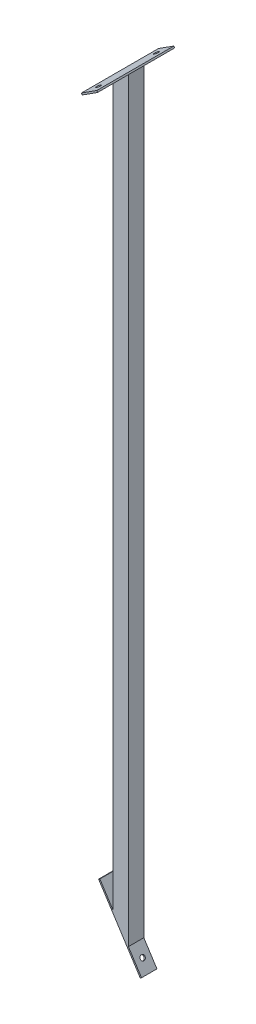
ISO-10303-21;
HEADER;
FILE_DESCRIPTION(('STEP AP214'),'2;1');
FILE_NAME('part.step','',(''),(''),'','','');
FILE_SCHEMA(('AUTOMOTIVE_DESIGN { 1 0 10303 214 1 1 1 1 }'));
ENDSEC;
DATA;
#1=APPLICATION_CONTEXT('core data for automotive mechanical design processes');
#2=APPLICATION_PROTOCOL_DEFINITION('international standard','automotive_design',2000,#1);
#3=PRODUCT_CONTEXT('',#1,'mechanical');
#4=PRODUCT('Part','Part','',(#3));
#5=PRODUCT_RELATED_PRODUCT_CATEGORY('part','',(#4));
#6=PRODUCT_DEFINITION_FORMATION('','',#4);
#7=PRODUCT_DEFINITION_CONTEXT('part definition',#1,'design');
#8=PRODUCT_DEFINITION('design','',#6,#7);
#9=PRODUCT_DEFINITION_SHAPE('','',#8);
#10=(LENGTH_UNIT() NAMED_UNIT(*) SI_UNIT(.MILLI.,.METRE.));
#11=(NAMED_UNIT(*) PLANE_ANGLE_UNIT() SI_UNIT($,.RADIAN.));
#12=(NAMED_UNIT(*) SI_UNIT($,.STERADIAN.) SOLID_ANGLE_UNIT());
#13=UNCERTAINTY_MEASURE_WITH_UNIT(LENGTH_MEASURE(1.E-05),#10,'distance_accuracy_value','');
#14=(GEOMETRIC_REPRESENTATION_CONTEXT(3) GLOBAL_UNCERTAINTY_ASSIGNED_CONTEXT((#13)) GLOBAL_UNIT_ASSIGNED_CONTEXT((#10,
#11,#12)) REPRESENTATION_CONTEXT('',''));
#15=CARTESIAN_POINT('',(0.,0.,0.));
#16=DIRECTION('',(0.,0.,1.));
#17=DIRECTION('',(1.,0.,0.));
#18=AXIS2_PLACEMENT_3D('',#15,#16,#17);
#19=CARTESIAN_POINT('',(-446.916807878554,695.141308373975,0.));
#20=DIRECTION('',(0.540792055418549,-0.841156318882632,0.));
#21=DIRECTION('',(0.841156318882632,0.540792055418549,0.));
#22=AXIS2_PLACEMENT_3D('',#19,#20,#21);
#23=PLANE('',#22);
#24=CARTESIAN_POINT('',(0.,982.470849516569,37.5));
#25=DIRECTION('',(-0.540792055418549,0.841156318882632,0.));
#26=DIRECTION('',(-0.841156318882632,-0.540792055418549,0.));
#27=AXIS2_PLACEMENT_3D('',#24,#25,#26);
#28=CIRCLE('',#27,3.12500000000005);
#29=CARTESIAN_POINT('',(-2.62861349650831,980.780874343386,37.5));
#30=VERTEX_POINT('',#29);
#31=EDGE_CURVE('E573',#30,#30,#28,.T.);
#32=ORIENTED_EDGE('',*,*,#31,.T.);
#33=EDGE_LOOP('',(#32));
#34=FACE_BOUND('',#33,.T.);
#35=DIRECTION('',(0.841156318882634,0.540792055418547,0.));
#36=VECTOR('',#35,1.);
#37=CARTESIAN_POINT('',(10.,988.9,10.));
#38=LINE('',#37,#36);
#39=CARTESIAN_POINT('',(-9.9999999999999,976.041699033138,10.));
#40=VERTEX_POINT('',#39);
#41=CARTESIAN_POINT('',(10.,988.9,10.));
#42=VERTEX_POINT('',#41);
#43=EDGE_CURVE('E248',#40,#42,#38,.T.);
#44=ORIENTED_EDGE('',*,*,#43,.T.);
#45=DIRECTION('',(0.,0.,-1.));
#46=VECTOR('',#45,1.);
#47=CARTESIAN_POINT('',(10.,988.9,50.));
#48=LINE('',#47,#46);
#49=CARTESIAN_POINT('',(10.,988.9,50.));
#50=VERTEX_POINT('',#49);
#51=EDGE_CURVE('E564',#50,#42,#48,.T.);
#52=ORIENTED_EDGE('',*,*,#51,.F.);
#53=DIRECTION('',(0.841156318882632,0.540792055418549,0.));
#54=VECTOR('',#53,1.);
#55=CARTESIAN_POINT('',(-9.9999999999999,976.041699033138,50.));
#56=LINE('',#55,#54);
#57=CARTESIAN_POINT('',(-9.9999999999999,976.041699033138,50.));
#58=VERTEX_POINT('',#57);
#59=EDGE_CURVE('E189',#58,#50,#56,.T.);
#60=ORIENTED_EDGE('',*,*,#59,.F.);
#61=DIRECTION('',(0.,0.,1.));
#62=VECTOR('',#61,1.);
#63=CARTESIAN_POINT('',(-9.9999999999999,976.041699033138,50.));
#64=LINE('',#63,#62);
#65=EDGE_CURVE('E550',#40,#58,#64,.T.);
#66=ORIENTED_EDGE('',*,*,#65,.F.);
#67=EDGE_LOOP('',(#44,#52,#60,#66));
#68=FACE_BOUND('',#67,.T.);
#69=ADVANCED_FACE('F52',(#34,#68),#23,.T.);
#70=CARTESIAN_POINT('',(0.,982.470849516569,-37.5));
#71=DIRECTION('',(-0.540792055418549,0.841156318882632,0.));
#72=DIRECTION('',(-0.841156318882632,-0.540792055418549,0.));
#73=AXIS2_PLACEMENT_3D('',#70,#71,#72);
#74=CIRCLE('',#73,3.12500000000005);
#75=CARTESIAN_POINT('',(-2.62861349650831,980.780874343386,-37.5));
#76=VERTEX_POINT('',#75);
#77=EDGE_CURVE('E566',#76,#76,#74,.T.);
#78=ORIENTED_EDGE('',*,*,#77,.T.);
#79=EDGE_LOOP('',(#78));
#80=FACE_BOUND('',#79,.T.);
#81=DIRECTION('',(0.841156318882634,0.540792055418547,0.));
#82=VECTOR('',#81,1.);
#83=CARTESIAN_POINT('',(10.,988.9,-10.));
#84=LINE('',#83,#82);
#85=CARTESIAN_POINT('',(-10.,976.041699033138,-10.));
#86=VERTEX_POINT('',#85);
#87=CARTESIAN_POINT('',(10.,988.9,-10.));
#88=VERTEX_POINT('',#87);
#89=EDGE_CURVE('E249',#86,#88,#84,.T.);
#90=ORIENTED_EDGE('',*,*,#89,.F.);
#91=CARTESIAN_POINT('',(-9.9999999999999,976.041699033138,-50.));
#92=VERTEX_POINT('',#91);
#93=EDGE_CURVE('E549',#92,#86,#64,.T.);
#94=ORIENTED_EDGE('',*,*,#93,.F.);
#95=DIRECTION('',(-0.841156318882632,-0.540792055418549,0.));
#96=VECTOR('',#95,1.);
#97=CARTESIAN_POINT('',(-9.9999999999999,976.041699033138,-50.));
#98=LINE('',#97,#96);
#99=CARTESIAN_POINT('',(10.,988.9,-50.));
#100=VERTEX_POINT('',#99);
#101=EDGE_CURVE('E553',#100,#92,#98,.T.);
#102=ORIENTED_EDGE('',*,*,#101,.F.);
#103=EDGE_CURVE('E195',#88,#100,#48,.T.);
#104=ORIENTED_EDGE('',*,*,#103,.F.);
#105=EDGE_LOOP('',(#90,#94,#102,#104));
#106=FACE_BOUND('',#105,.T.);
#107=ADVANCED_FACE('F338',(#80,#106),#23,.T.);
#108=CARTESIAN_POINT('',(8.91841588916291,990.582312637765,50.));
#109=DIRECTION('',(-0.841156318882634,-0.540792055418547,0.));
#110=DIRECTION('',(0.540792055418547,-0.841156318882634,0.));
#111=AXIS2_PLACEMENT_3D('',#108,#109,#110);
#112=PLANE('',#111);
#113=ORIENTED_EDGE('',*,*,#51,.T.);
#114=DIRECTION('',(0.,0.,-1.));
#115=VECTOR('',#114,1.);
#116=CARTESIAN_POINT('',(10.,988.9,-10.));
#117=LINE('',#116,#115);
#118=EDGE_CURVE('E268',#42,#88,#117,.T.);
#119=ORIENTED_EDGE('',*,*,#118,.T.);
#120=ORIENTED_EDGE('',*,*,#103,.T.);
#121=DIRECTION('',(0.540792055418547,-0.841156318882634,0.));
#122=VECTOR('',#121,1.);
#123=CARTESIAN_POINT('',(8.91841588916291,990.582312637765,-50.));
#124=LINE('',#123,#122);
#125=CARTESIAN_POINT('',(8.91841588916291,990.582312637765,-50.));
#126=VERTEX_POINT('',#125);
#127=EDGE_CURVE('E174',#126,#100,#124,.T.);
#128=ORIENTED_EDGE('',*,*,#127,.F.);
#129=DIRECTION('',(0.,0.,-1.));
#130=VECTOR('',#129,1.);
#131=CARTESIAN_POINT('',(8.91841588916291,990.582312637765,50.));
#132=LINE('',#131,#130);
#133=CARTESIAN_POINT('',(8.91841588916291,990.582312637765,50.));
#134=VERTEX_POINT('',#133);
#135=EDGE_CURVE('E180',#134,#126,#132,.T.);
#136=ORIENTED_EDGE('',*,*,#135,.F.);
#137=DIRECTION('',(0.540792055418547,-0.841156318882634,0.));
#138=VECTOR('',#137,1.);
#139=CARTESIAN_POINT('',(8.91841588916291,990.582312637765,50.));
#140=LINE('',#139,#138);
#141=EDGE_CURVE('E557',#134,#50,#140,.T.);
#142=ORIENTED_EDGE('',*,*,#141,.T.);
#143=EDGE_LOOP('',(#113,#119,#120,#128,#136,#142));
#144=FACE_BOUND('',#143,.T.);
#145=ADVANCED_FACE('F192',(#144),#112,.F.);
#146=CARTESIAN_POINT('',(-11.081584110837,977.724011670903,-50.));
#147=DIRECTION('',(0.,0.,1.));
#148=DIRECTION('',(1.,0.,0.));
#149=AXIS2_PLACEMENT_3D('',#146,#147,#148);
#150=PLANE('',#149);
#151=ORIENTED_EDGE('',*,*,#101,.T.);
#152=DIRECTION('',(0.540792055418547,-0.841156318882634,0.));
#153=VECTOR('',#152,1.);
#154=CARTESIAN_POINT('',(-11.081584110837,977.724011670903,-50.));
#155=LINE('',#154,#153);
#156=CARTESIAN_POINT('',(-11.081584110837,977.724011670903,-50.));
#157=VERTEX_POINT('',#156);
#158=EDGE_CURVE('E176',#157,#92,#155,.T.);
#159=ORIENTED_EDGE('',*,*,#158,.F.);
#160=DIRECTION('',(-0.841156318882632,-0.540792055418549,0.));
#161=VECTOR('',#160,1.);
#162=CARTESIAN_POINT('',(-11.081584110837,977.724011670903,-50.));
#163=LINE('',#162,#161);
#164=EDGE_CURVE('E170',#126,#157,#163,.T.);
#165=ORIENTED_EDGE('',*,*,#164,.F.);
#166=ORIENTED_EDGE('',*,*,#127,.T.);
#167=EDGE_LOOP('',(#151,#159,#165,#166));
#168=FACE_BOUND('',#167,.T.);
#169=ADVANCED_FACE('F172',(#168),#150,.F.);
#170=CARTESIAN_POINT('',(-11.081584110837,977.724011670903,50.));
#171=DIRECTION('',(0.841156318882634,0.540792055418547,0.));
#172=DIRECTION('',(-0.540792055418547,0.841156318882634,0.));
#173=AXIS2_PLACEMENT_3D('',#170,#171,#172);
#174=PLANE('',#173);
#175=ORIENTED_EDGE('',*,*,#93,.T.);
#176=DIRECTION('',(0.,0.,1.));
#177=VECTOR('',#176,1.);
#178=CARTESIAN_POINT('',(-10.,976.041699033138,-10.));
#179=LINE('',#178,#177);
#180=EDGE_CURVE('E251',#86,#40,#179,.T.);
#181=ORIENTED_EDGE('',*,*,#180,.T.);
#182=ORIENTED_EDGE('',*,*,#65,.T.);
#183=DIRECTION('',(0.540792055418547,-0.841156318882634,0.));
#184=VECTOR('',#183,1.);
#185=CARTESIAN_POINT('',(-11.081584110837,977.724011670903,50.));
#186=LINE('',#185,#184);
#187=CARTESIAN_POINT('',(-11.081584110837,977.724011670903,50.));
#188=VERTEX_POINT('',#187);
#189=EDGE_CURVE('E201',#188,#58,#186,.T.);
#190=ORIENTED_EDGE('',*,*,#189,.F.);
#191=DIRECTION('',(0.,0.,1.));
#192=VECTOR('',#191,1.);
#193=CARTESIAN_POINT('',(-11.081584110837,977.724011670903,50.));
#194=LINE('',#193,#192);
#195=EDGE_CURVE('E179',#157,#188,#194,.T.);
#196=ORIENTED_EDGE('',*,*,#195,.F.);
#197=ORIENTED_EDGE('',*,*,#158,.T.);
#198=EDGE_LOOP('',(#175,#181,#182,#190,#196,#197));
#199=FACE_BOUND('',#198,.T.);
#200=ADVANCED_FACE('F360',(#199),#174,.F.);
#201=CARTESIAN_POINT('',(-11.081584110837,977.724011670903,50.));
#202=DIRECTION('',(0.,0.,-1.));
#203=DIRECTION('',(-1.,0.,0.));
#204=AXIS2_PLACEMENT_3D('',#201,#202,#203);
#205=PLANE('',#204);
#206=ORIENTED_EDGE('',*,*,#59,.T.);
#207=ORIENTED_EDGE('',*,*,#141,.F.);
#208=DIRECTION('',(0.841156318882632,0.540792055418549,0.));
#209=VECTOR('',#208,1.);
#210=CARTESIAN_POINT('',(-11.081584110837,977.724011670903,50.));
#211=LINE('',#210,#209);
#212=EDGE_CURVE('E185',#188,#134,#211,.T.);
#213=ORIENTED_EDGE('',*,*,#212,.F.);
#214=ORIENTED_EDGE('',*,*,#189,.T.);
#215=EDGE_LOOP('',(#206,#207,#213,#214));
#216=FACE_BOUND('',#215,.T.);
#217=ADVANCED_FACE('F367',(#216),#205,.F.);
#218=CARTESIAN_POINT('',(-447.998391989391,696.82362101174,0.));
#219=DIRECTION('',(0.540792055418549,-0.841156318882632,0.));
#220=DIRECTION('',(0.841156318882632,0.540792055418549,0.));
#221=AXIS2_PLACEMENT_3D('',#218,#219,#220);
#222=PLANE('',#221);
#223=CARTESIAN_POINT('',(-1.08158411083714,984.153162154334,-37.5));
#224=DIRECTION('',(-0.540792055418549,0.841156318882632,0.));
#225=DIRECTION('',(-0.841156318882632,-0.540792055418549,0.));
#226=AXIS2_PLACEMENT_3D('',#223,#224,#225);
#227=CIRCLE('',#226,3.12500000000005);
#228=CARTESIAN_POINT('',(-3.71019760734541,982.463186981151,-37.5));
#229=VERTEX_POINT('',#228);
#230=EDGE_CURVE('E577',#229,#229,#227,.T.);
#231=ORIENTED_EDGE('',*,*,#230,.F.);
#232=EDGE_LOOP('',(#231));
#233=FACE_BOUND('',#232,.T.);
#234=CARTESIAN_POINT('',(-1.08158411083714,984.153162154334,37.5));
#235=DIRECTION('',(-0.540792055418549,0.841156318882632,0.));
#236=DIRECTION('',(-0.841156318882632,-0.540792055418549,0.));
#237=AXIS2_PLACEMENT_3D('',#234,#235,#236);
#238=CIRCLE('',#237,3.12500000000005);
#239=CARTESIAN_POINT('',(-3.71019760734541,982.463186981151,37.5));
#240=VERTEX_POINT('',#239);
#241=EDGE_CURVE('E570',#240,#240,#238,.T.);
#242=ORIENTED_EDGE('',*,*,#241,.F.);
#243=EDGE_LOOP('',(#242));
#244=FACE_BOUND('',#243,.T.);
#245=ORIENTED_EDGE('',*,*,#135,.T.);
#246=ORIENTED_EDGE('',*,*,#164,.T.);
#247=ORIENTED_EDGE('',*,*,#195,.T.);
#248=ORIENTED_EDGE('',*,*,#212,.T.);
#249=EDGE_LOOP('',(#245,#246,#247,#248));
#250=FACE_BOUND('',#249,.T.);
#251=ADVANCED_FACE('F183',(#233,#244,#250),#222,.F.);
#252=CARTESIAN_POINT('',(-28.7219154086927,65.386403284521,-9.99999999999999));
#253=DIRECTION('',(0.540792055418547,-0.841156318882634,0.));
#254=DIRECTION('',(0.841156318882634,0.540792055418547,0.));
#255=AXIS2_PLACEMENT_3D('',#252,#253,#254);
#256=PLANE('',#255);
#257=DIRECTION('',(0.,0.,-1.));
#258=VECTOR('',#257,1.);
#259=CARTESIAN_POINT('',(-27.0396027709274,66.4679873953581,-9.99999999999999));
#260=LINE('',#259,#258);
#261=CARTESIAN_POINT('',(-27.0396027709274,66.4679873953581,10.));
#262=VERTEX_POINT('',#261);
#263=CARTESIAN_POINT('',(-27.0396027709274,66.4679873953581,-9.99999999999999));
#264=VERTEX_POINT('',#263);
#265=EDGE_CURVE('E217',#262,#264,#260,.T.);
#266=ORIENTED_EDGE('',*,*,#265,.T.);
#267=DIRECTION('',(0.841156318882634,0.540792055418547,0.));
#268=VECTOR('',#267,1.);
#269=CARTESIAN_POINT('',(-28.7219154086927,65.386403284521,-9.99999999999999));
#270=LINE('',#269,#268);
#271=CARTESIAN_POINT('',(-28.7219154086927,65.386403284521,-9.99999999999999));
#272=VERTEX_POINT('',#271);
#273=EDGE_CURVE('E227',#272,#264,#270,.T.);
#274=ORIENTED_EDGE('',*,*,#273,.F.);
#275=DIRECTION('',(0.,0.,-1.));
#276=VECTOR('',#275,1.);
#277=CARTESIAN_POINT('',(-28.7219154086927,65.386403284521,-9.99999999999999));
#278=LINE('',#277,#276);
#279=CARTESIAN_POINT('',(-28.7219154086927,65.386403284521,10.));
#280=VERTEX_POINT('',#279);
#281=EDGE_CURVE('E208',#280,#272,#278,.T.);
#282=ORIENTED_EDGE('',*,*,#281,.F.);
#283=DIRECTION('',(0.841156318882634,0.540792055418547,0.));
#284=VECTOR('',#283,1.);
#285=CARTESIAN_POINT('',(-28.7219154086927,65.386403284521,10.));
#286=LINE('',#285,#284);
#287=EDGE_CURVE('E229',#280,#262,#286,.T.);
#288=ORIENTED_EDGE('',*,*,#287,.T.);
#289=EDGE_LOOP('',(#266,#274,#282,#288));
#290=FACE_BOUND('',#289,.T.);
#291=ADVANCED_FACE('F382',(#290),#256,.F.);
#292=CARTESIAN_POINT('',(9.42164623299234,6.05731814335602,0.));
#293=DIRECTION('',(0.841156318882634,0.540792055418547,0.));
#294=DIRECTION('',(-0.540792055418547,0.841156318882634,0.));
#295=AXIS2_PLACEMENT_3D('',#292,#293,#294);
#296=PLANE('',#295);
#297=CARTESIAN_POINT('',(16.8374887476984,-5.47739788766199,0.));
#298=DIRECTION('',(0.841156318882634,0.540792055418547,0.));
#299=DIRECTION('',(-0.540792055418547,0.841156318882634,0.));
#300=AXIS2_PLACEMENT_3D('',#297,#298,#299);
#301=CIRCLE('',#300,3.125);
#302=CARTESIAN_POINT('',(15.1475135745155,-2.84878439115376,0.));
#303=VERTEX_POINT('',#302);
#304=EDGE_CURVE('E574',#303,#303,#301,.T.);
#305=ORIENTED_EDGE('',*,*,#304,.T.);
#306=EDGE_LOOP('',(#305));
#307=FACE_BOUND('',#306,.T.);
#308=DIRECTION('',(-0.540792055418547,0.841156318882634,0.));
#309=VECTOR('',#308,1.);
#310=CARTESIAN_POINT('',(25.357290133162,-18.7292286037423,10.));
#311=LINE('',#310,#309);
#312=CARTESIAN_POINT('',(25.357290133162,-18.7292286037423,10.));
#313=VERTEX_POINT('',#312);
#314=EDGE_CURVE('E205',#313,#280,#311,.T.);
#315=ORIENTED_EDGE('',*,*,#314,.T.);
#316=ORIENTED_EDGE('',*,*,#281,.T.);
#317=DIRECTION('',(0.540792055418547,-0.841156318882634,0.));
#318=VECTOR('',#317,1.);
#319=CARTESIAN_POINT('',(25.357290133162,-18.7292286037423,-9.99999999999999));
#320=LINE('',#319,#318);
#321=CARTESIAN_POINT('',(25.357290133162,-18.7292286037423,-9.99999999999999));
#322=VERTEX_POINT('',#321);
#323=EDGE_CURVE('E211',#272,#322,#320,.T.);
#324=ORIENTED_EDGE('',*,*,#323,.T.);
#325=DIRECTION('',(0.,0.,1.));
#326=VECTOR('',#325,1.);
#327=CARTESIAN_POINT('',(25.357290133162,-18.7292286037423,-9.99999999999999));
#328=LINE('',#327,#326);
#329=EDGE_CURVE('E213',#322,#313,#328,.T.);
#330=ORIENTED_EDGE('',*,*,#329,.T.);
#331=EDGE_LOOP('',(#315,#316,#324,#330));
#332=FACE_BOUND('',#331,.T.);
#333=ADVANCED_FACE('F391',(#307,#332),#296,.F.);
#334=CARTESIAN_POINT('',(25.357290133162,-18.7292286037423,-9.99999999999999));
#335=DIRECTION('',(-0.540792055418547,0.841156318882634,0.));
#336=DIRECTION('',(-0.841156318882634,-0.540792055418547,0.));
#337=AXIS2_PLACEMENT_3D('',#334,#335,#336);
#338=PLANE('',#337);
#339=DIRECTION('',(0.,0.,1.));
#340=VECTOR('',#339,1.);
#341=CARTESIAN_POINT('',(27.0396027709273,-17.6476444929052,-9.99999999999999));
#342=LINE('',#341,#340);
#343=CARTESIAN_POINT('',(27.0396027709273,-17.6476444929052,-9.99999999999999));
#344=VERTEX_POINT('',#343);
#345=CARTESIAN_POINT('',(27.0396027709273,-17.6476444929052,10.));
#346=VERTEX_POINT('',#345);
#347=EDGE_CURVE('E209',#344,#346,#342,.T.);
#348=ORIENTED_EDGE('',*,*,#347,.T.);
#349=DIRECTION('',(0.841156318882634,0.540792055418547,0.));
#350=VECTOR('',#349,1.);
#351=CARTESIAN_POINT('',(25.357290133162,-18.7292286037423,10.));
#352=LINE('',#351,#350);
#353=EDGE_CURVE('E214',#313,#346,#352,.T.);
#354=ORIENTED_EDGE('',*,*,#353,.F.);
#355=ORIENTED_EDGE('',*,*,#329,.F.);
#356=DIRECTION('',(0.841156318882634,0.540792055418547,0.));
#357=VECTOR('',#356,1.);
#358=CARTESIAN_POINT('',(25.357290133162,-18.7292286037423,-9.99999999999999));
#359=LINE('',#358,#357);
#360=EDGE_CURVE('E224',#322,#344,#359,.T.);
#361=ORIENTED_EDGE('',*,*,#360,.T.);
#362=EDGE_LOOP('',(#348,#354,#355,#361));
#363=FACE_BOUND('',#362,.T.);
#364=ADVANCED_FACE('F401',(#363),#338,.F.);
#365=CARTESIAN_POINT('',(11.1039588707576,7.13890225419312,0.));
#366=DIRECTION('',(0.841156318882634,0.540792055418547,0.));
#367=DIRECTION('',(-0.540792055418547,0.841156318882634,0.));
#368=AXIS2_PLACEMENT_3D('',#365,#366,#367);
#369=PLANE('',#368);
#370=CARTESIAN_POINT('',(18.5198013854637,-4.3958137768249,0.));
#371=DIRECTION('',(0.841156318882634,0.540792055418547,0.));
#372=DIRECTION('',(-0.540792055418547,0.841156318882634,0.));
#373=AXIS2_PLACEMENT_3D('',#370,#371,#372);
#374=CIRCLE('',#373,3.125);
#375=CARTESIAN_POINT('',(16.8298262122807,-1.76720028031667,0.));
#376=VERTEX_POINT('',#375);
#377=EDGE_CURVE('E582',#376,#376,#374,.T.);
#378=ORIENTED_EDGE('',*,*,#377,.F.);
#379=EDGE_LOOP('',(#378));
#380=FACE_BOUND('',#379,.T.);
#381=DIRECTION('',(0.,0.,-1.));
#382=VECTOR('',#381,1.);
#383=CARTESIAN_POINT('',(10.,8.85601693925575,-9.99999999999974));
#384=LINE('',#383,#382);
#385=CARTESIAN_POINT('',(10.0000000000001,8.85601693925543,10.));
#386=VERTEX_POINT('',#385);
#387=CARTESIAN_POINT('',(10.0000000000001,8.85601693925544,-9.99999999999999));
#388=VERTEX_POINT('',#387);
#389=EDGE_CURVE('E232',#386,#388,#384,.T.);
#390=ORIENTED_EDGE('',*,*,#389,.F.);
#391=DIRECTION('',(-0.540792055418547,0.841156318882634,0.));
#392=VECTOR('',#391,1.);
#393=CARTESIAN_POINT('',(27.0396027709273,-17.6476444929052,10.));
#394=LINE('',#393,#392);
#395=EDGE_CURVE('E199',#346,#386,#394,.T.);
#396=ORIENTED_EDGE('',*,*,#395,.F.);
#397=ORIENTED_EDGE('',*,*,#347,.F.);
#398=DIRECTION('',(0.540792055418547,-0.841156318882634,0.));
#399=VECTOR('',#398,1.);
#400=CARTESIAN_POINT('',(27.0396027709273,-17.6476444929052,-9.99999999999999));
#401=LINE('',#400,#399);
#402=EDGE_CURVE('E219',#388,#344,#401,.T.);
#403=ORIENTED_EDGE('',*,*,#402,.F.);
#404=EDGE_LOOP('',(#390,#396,#397,#403));
#405=FACE_BOUND('',#404,.T.);
#406=ADVANCED_FACE('F309',(#380,#405),#369,.T.);
#407=DIRECTION('',(0.,0.,1.));
#408=VECTOR('',#407,1.);
#409=CARTESIAN_POINT('',(-10.,39.9643259631971,10.));
#410=LINE('',#409,#408);
#411=CARTESIAN_POINT('',(-10.,39.9643259631973,-10.));
#412=VERTEX_POINT('',#411);
#413=CARTESIAN_POINT('',(-10.,39.9643259631971,10.));
#414=VERTEX_POINT('',#413);
#415=EDGE_CURVE('E235',#412,#414,#410,.T.);
#416=ORIENTED_EDGE('',*,*,#415,.F.);
#417=EDGE_CURVE('E78',#264,#412,#401,.T.);
#418=ORIENTED_EDGE('',*,*,#417,.F.);
#419=ORIENTED_EDGE('',*,*,#265,.F.);
#420=EDGE_CURVE('E197',#414,#262,#394,.T.);
#421=ORIENTED_EDGE('',*,*,#420,.F.);
#422=EDGE_LOOP('',(#416,#418,#419,#421));
#423=FACE_BOUND('',#422,.T.);
#424=ADVANCED_FACE('F308',(#423),#369,.T.);
#425=CARTESIAN_POINT('',(-10.,988.9,10.));
#426=DIRECTION('',(1.,0.,0.));
#427=DIRECTION('',(0.,0.,-1.));
#428=AXIS2_PLACEMENT_3D('',#425,#426,#427);
#429=PLANE('',#428);
#430=DIRECTION('',(0.,-1.,0.));
#431=VECTOR('',#430,1.);
#432=CARTESIAN_POINT('',(-10.,988.9,-10.));
#433=LINE('',#432,#431);
#434=EDGE_CURVE('E271',#86,#412,#433,.T.);
#435=ORIENTED_EDGE('',*,*,#434,.T.);
#436=ORIENTED_EDGE('',*,*,#415,.T.);
#437=DIRECTION('',(0.,-1.,0.));
#438=VECTOR('',#437,1.);
#439=CARTESIAN_POINT('',(-10.,988.9,10.));
#440=LINE('',#439,#438);
#441=EDGE_CURVE('E12',#40,#414,#440,.T.);
#442=ORIENTED_EDGE('',*,*,#441,.F.);
#443=ORIENTED_EDGE('',*,*,#180,.F.);
#444=EDGE_LOOP('',(#435,#436,#442,#443));
#445=FACE_BOUND('',#444,.T.);
#446=ADVANCED_FACE('F422',(#445),#429,.F.);
#447=CARTESIAN_POINT('',(10.,988.9,-10.));
#448=DIRECTION('',(-1.,0.,0.));
#449=DIRECTION('',(0.,0.,1.));
#450=AXIS2_PLACEMENT_3D('',#447,#448,#449);
#451=PLANE('',#450);
#452=DIRECTION('',(0.,-1.,0.));
#453=VECTOR('',#452,1.);
#454=CARTESIAN_POINT('',(10.,988.9,10.));
#455=LINE('',#454,#453);
#456=EDGE_CURVE('E62',#42,#386,#455,.T.);
#457=ORIENTED_EDGE('',*,*,#456,.T.);
#458=ORIENTED_EDGE('',*,*,#389,.T.);
#459=DIRECTION('',(0.,-1.,0.));
#460=VECTOR('',#459,1.);
#461=CARTESIAN_POINT('',(10.,988.9,-10.));
#462=LINE('',#461,#460);
#463=EDGE_CURVE('E274',#88,#388,#462,.T.);
#464=ORIENTED_EDGE('',*,*,#463,.F.);
#465=ORIENTED_EDGE('',*,*,#118,.F.);
#466=EDGE_LOOP('',(#457,#458,#464,#465));
#467=FACE_BOUND('',#466,.T.);
#468=ADVANCED_FACE('F431',(#467),#451,.F.);
#469=CARTESIAN_POINT('',(10.,988.9,-10.));
#470=DIRECTION('',(0.,0.,1.));
#471=DIRECTION('',(1.,0.,0.));
#472=AXIS2_PLACEMENT_3D('',#469,#470,#471);
#473=PLANE('',#472);
#474=ORIENTED_EDGE('',*,*,#463,.T.);
#475=ORIENTED_EDGE('',*,*,#402,.T.);
#476=ORIENTED_EDGE('',*,*,#360,.F.);
#477=ORIENTED_EDGE('',*,*,#323,.F.);
#478=ORIENTED_EDGE('',*,*,#273,.T.);
#479=ORIENTED_EDGE('',*,*,#417,.T.);
#480=ORIENTED_EDGE('',*,*,#434,.F.);
#481=ORIENTED_EDGE('',*,*,#89,.T.);
#482=EDGE_LOOP('',(#474,#475,#476,#477,#478,#479,#480,#481));
#483=FACE_BOUND('',#482,.T.);
#484=ADVANCED_FACE('F426',(#483),#473,.F.);
#485=CARTESIAN_POINT('',(-10.,988.9,10.));
#486=DIRECTION('',(0.,0.,-1.));
#487=DIRECTION('',(-1.,0.,0.));
#488=AXIS2_PLACEMENT_3D('',#485,#486,#487);
#489=PLANE('',#488);
#490=ORIENTED_EDGE('',*,*,#441,.T.);
#491=ORIENTED_EDGE('',*,*,#420,.T.);
#492=ORIENTED_EDGE('',*,*,#287,.F.);
#493=ORIENTED_EDGE('',*,*,#314,.F.);
#494=ORIENTED_EDGE('',*,*,#353,.T.);
#495=ORIENTED_EDGE('',*,*,#395,.T.);
#496=ORIENTED_EDGE('',*,*,#456,.F.);
#497=ORIENTED_EDGE('',*,*,#43,.F.);
#498=EDGE_LOOP('',(#490,#491,#492,#493,#494,#495,#496,#497));
#499=FACE_BOUND('',#498,.T.);
#500=ADVANCED_FACE('F430',(#499),#489,.F.);
#501=CARTESIAN_POINT('',(0.,982.470849516569,37.5));
#502=DIRECTION('',(-0.540792055418549,0.841156318882632,0.));
#503=DIRECTION('',(-0.841156318882632,-0.540792055418549,0.));
#504=AXIS2_PLACEMENT_3D('',#501,#502,#503);
#505=CYLINDRICAL_SURFACE('',#504,3.12500000000005);
#506=ORIENTED_EDGE('',*,*,#31,.F.);
#507=EDGE_LOOP('',(#506));
#508=FACE_BOUND('',#507,.T.);
#509=ORIENTED_EDGE('',*,*,#241,.T.);
#510=EDGE_LOOP('',(#509));
#511=FACE_BOUND('',#510,.T.);
#512=ADVANCED_FACE('F438',(#508,#511),#505,.F.);
#513=CARTESIAN_POINT('',(0.,982.470849516569,-37.5));
#514=DIRECTION('',(-0.540792055418549,0.841156318882632,0.));
#515=DIRECTION('',(-0.841156318882632,-0.540792055418549,0.));
#516=AXIS2_PLACEMENT_3D('',#513,#514,#515);
#517=CYLINDRICAL_SURFACE('',#516,3.12500000000005);
#518=ORIENTED_EDGE('',*,*,#77,.F.);
#519=EDGE_LOOP('',(#518));
#520=FACE_BOUND('',#519,.T.);
#521=ORIENTED_EDGE('',*,*,#230,.T.);
#522=EDGE_LOOP('',(#521));
#523=FACE_BOUND('',#522,.T.);
#524=ADVANCED_FACE('F445',(#520,#523),#517,.F.);
#525=CARTESIAN_POINT('',(16.8374887476984,-5.47739788766199,0.));
#526=DIRECTION('',(0.841156318882634,0.540792055418547,0.));
#527=DIRECTION('',(-0.540792055418547,0.841156318882634,0.));
#528=AXIS2_PLACEMENT_3D('',#525,#526,#527);
#529=CYLINDRICAL_SURFACE('',#528,3.125);
#530=ORIENTED_EDGE('',*,*,#304,.F.);
#531=EDGE_LOOP('',(#530));
#532=FACE_BOUND('',#531,.T.);
#533=ORIENTED_EDGE('',*,*,#377,.T.);
#534=EDGE_LOOP('',(#533));
#535=FACE_BOUND('',#534,.T.);
#536=ADVANCED_FACE('F452',(#532,#535),#529,.F.);
#537=CLOSED_SHELL('',(#69,#107,#145,#169,#200,#217,#251,#291,#333,#364,#406,#424,#446,#468,#484,
#500,#512,#524,#536));
#538=CARTESIAN_POINT('',(-8.,988.9,8.));
#539=DIRECTION('',(0.,0.,-1.));
#540=DIRECTION('',(-1.,0.,0.));
#541=AXIS2_PLACEMENT_3D('',#538,#539,#540);
#542=PLANE('',#541);
#543=DIRECTION('',(0.540792055418547,-0.841156318882634,0.));
#544=VECTOR('',#543,1.);
#545=CARTESIAN_POINT('',(-441.077057857464,710.468242411273,8.));
#546=LINE('',#545,#544);
#547=CARTESIAN_POINT('',(-8.,36.853495060803,8.));
#548=VERTEX_POINT('',#547);
#549=CARTESIAN_POINT('',(8.,11.9668478416497,8.));
#550=VERTEX_POINT('',#549);
#551=EDGE_CURVE('E245',#548,#550,#546,.T.);
#552=ORIENTED_EDGE('',*,*,#551,.F.);
#553=DIRECTION('',(0.,-1.,0.));
#554=VECTOR('',#553,1.);
#555=CARTESIAN_POINT('',(-8.,988.9,8.));
#556=LINE('',#555,#554);
#557=CARTESIAN_POINT('',(-8.,977.327529129824,8.));
#558=VERTEX_POINT('',#557);
#559=EDGE_CURVE('E56',#558,#548,#556,.T.);
#560=ORIENTED_EDGE('',*,*,#559,.F.);
#561=DIRECTION('',(-0.841156318882634,-0.540792055418547,0.));
#562=VECTOR('',#561,1.);
#563=CARTESIAN_POINT('',(-2.73579115033129,980.711968216897,8.));
#564=LINE('',#563,#562);
#565=CARTESIAN_POINT('',(8.,987.614169903314,8.));
#566=VERTEX_POINT('',#565);
#567=EDGE_CURVE('E265',#566,#558,#564,.T.);
#568=ORIENTED_EDGE('',*,*,#567,.F.);
#569=DIRECTION('',(0.,-1.,0.));
#570=VECTOR('',#569,1.);
#571=CARTESIAN_POINT('',(8.,988.9,8.));
#572=LINE('',#571,#570);
#573=EDGE_CURVE('E270',#566,#550,#572,.T.);
#574=ORIENTED_EDGE('',*,*,#573,.T.);
#575=EDGE_LOOP('',(#552,#560,#568,#574));
#576=FACE_BOUND('',#575,.T.);
#577=ADVANCED_FACE('F54',(#576),#542,.T.);
#578=CARTESIAN_POINT('',(-8.,988.9,8.));
#579=DIRECTION('',(1.,0.,0.));
#580=DIRECTION('',(0.,0.,-1.));
#581=AXIS2_PLACEMENT_3D('',#578,#579,#580);
#582=PLANE('',#581);
#583=DIRECTION('',(0.,0.,1.));
#584=VECTOR('',#583,1.);
#585=CARTESIAN_POINT('',(-8.,36.853495060803,7.99999999999997));
#586=LINE('',#585,#584);
#587=CARTESIAN_POINT('',(-8.00000000000001,36.8534950608028,-8.));
#588=VERTEX_POINT('',#587);
#589=EDGE_CURVE('E242',#588,#548,#586,.T.);
#590=ORIENTED_EDGE('',*,*,#589,.F.);
#591=DIRECTION('',(0.,-1.,0.));
#592=VECTOR('',#591,1.);
#593=CARTESIAN_POINT('',(-8.,988.9,-8.));
#594=LINE('',#593,#592);
#595=CARTESIAN_POINT('',(-8.,977.327529129824,-8.));
#596=VERTEX_POINT('',#595);
#597=EDGE_CURVE('E281',#596,#588,#594,.T.);
#598=ORIENTED_EDGE('',*,*,#597,.F.);
#599=DIRECTION('',(0.,0.,-1.));
#600=VECTOR('',#599,1.);
#601=CARTESIAN_POINT('',(-8.,977.327529129824,8.));
#602=LINE('',#601,#600);
#603=EDGE_CURVE('E262',#558,#596,#602,.T.);
#604=ORIENTED_EDGE('',*,*,#603,.F.);
#605=ORIENTED_EDGE('',*,*,#559,.T.);
#606=EDGE_LOOP('',(#590,#598,#604,#605));
#607=FACE_BOUND('',#606,.T.);
#608=ADVANCED_FACE('F289',(#607),#582,.T.);
#609=CARTESIAN_POINT('',(8.,988.9,-8.));
#610=DIRECTION('',(0.,0.,1.));
#611=DIRECTION('',(1.,0.,0.));
#612=AXIS2_PLACEMENT_3D('',#609,#610,#611);
#613=PLANE('',#612);
#614=DIRECTION('',(-0.540792055418547,0.841156318882634,0.));
#615=VECTOR('',#614,1.);
#616=CARTESIAN_POINT('',(-436.397761102203,703.189991937404,-8.));
#617=LINE('',#616,#615);
#618=CARTESIAN_POINT('',(8.,11.9668478416497,-8.));
#619=VERTEX_POINT('',#618);
#620=EDGE_CURVE('E239',#619,#588,#617,.T.);
#621=ORIENTED_EDGE('',*,*,#620,.F.);
#622=DIRECTION('',(0.,-1.,0.));
#623=VECTOR('',#622,1.);
#624=CARTESIAN_POINT('',(8.,988.9,-8.));
#625=LINE('',#624,#623);
#626=CARTESIAN_POINT('',(8.,987.614169903314,-8.));
#627=VERTEX_POINT('',#626);
#628=EDGE_CURVE('E280',#627,#619,#625,.T.);
#629=ORIENTED_EDGE('',*,*,#628,.F.);
#630=DIRECTION('',(0.841156318882634,0.540792055418547,0.));
#631=VECTOR('',#630,1.);
#632=CARTESIAN_POINT('',(8.58491209440763,987.990218690766,-8.));
#633=LINE('',#632,#631);
#634=EDGE_CURVE('E259',#596,#627,#633,.T.);
#635=ORIENTED_EDGE('',*,*,#634,.F.);
#636=ORIENTED_EDGE('',*,*,#597,.T.);
#637=EDGE_LOOP('',(#621,#629,#635,#636));
#638=FACE_BOUND('',#637,.T.);
#639=ADVANCED_FACE('F295',(#638),#613,.T.);
#640=CARTESIAN_POINT('',(8.,988.9,-8.));
#641=DIRECTION('',(-1.,0.,0.));
#642=DIRECTION('',(0.,0.,1.));
#643=AXIS2_PLACEMENT_3D('',#640,#641,#642);
#644=PLANE('',#643);
#645=DIRECTION('',(0.,0.,-1.));
#646=VECTOR('',#645,1.);
#647=CARTESIAN_POINT('',(8.,11.9668478416497,-7.9999999999997));
#648=LINE('',#647,#646);
#649=EDGE_CURVE('E70',#550,#619,#648,.T.);
#650=ORIENTED_EDGE('',*,*,#649,.F.);
#651=ORIENTED_EDGE('',*,*,#573,.F.);
#652=DIRECTION('',(0.,0.,1.));
#653=VECTOR('',#652,1.);
#654=CARTESIAN_POINT('',(8.,987.614169903314,-8.));
#655=LINE('',#654,#653);
#656=EDGE_CURVE('E256',#627,#566,#655,.T.);
#657=ORIENTED_EDGE('',*,*,#656,.F.);
#658=ORIENTED_EDGE('',*,*,#628,.T.);
#659=EDGE_LOOP('',(#650,#651,#657,#658));
#660=FACE_BOUND('',#659,.T.);
#661=ADVANCED_FACE('F298',(#660),#644,.T.);
#662=ORIENTED_EDGE('',*,*,#589,.T.);
#663=ORIENTED_EDGE('',*,*,#551,.T.);
#664=ORIENTED_EDGE('',*,*,#649,.T.);
#665=ORIENTED_EDGE('',*,*,#620,.T.);
#666=EDGE_LOOP('',(#662,#663,#664,#665));
#667=FACE_BOUND('',#666,.T.);
#668=ADVANCED_FACE('F293',(#667),#369,.T.);
#669=ORIENTED_EDGE('',*,*,#656,.T.);
#670=ORIENTED_EDGE('',*,*,#567,.T.);
#671=ORIENTED_EDGE('',*,*,#603,.T.);
#672=ORIENTED_EDGE('',*,*,#634,.T.);
#673=EDGE_LOOP('',(#669,#670,#671,#672));
#674=FACE_BOUND('',#673,.T.);
#675=ADVANCED_FACE('F297',(#674),#23,.T.);
#676=CLOSED_SHELL('',(#577,#608,#639,#661,#668,#675));
#677=ORIENTED_CLOSED_SHELL('',*,#676,.T.);
#678=BREP_WITH_VOIDS('B2',#537,(#677));
#679=ADVANCED_BREP_SHAPE_REPRESENTATION('',(#18,#678),#14);
#680=SHAPE_DEFINITION_REPRESENTATION(#9,#679);
ENDSEC;
END-ISO-10303-21;
